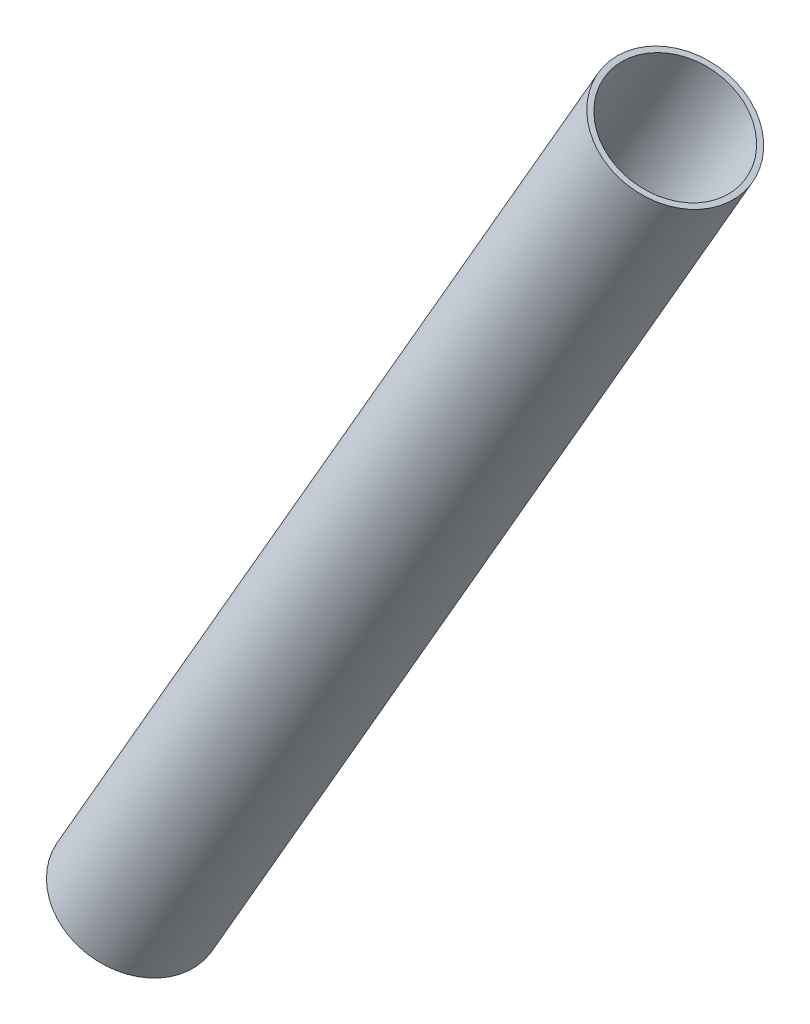
ISO-10303-21;
HEADER;
FILE_DESCRIPTION(('STEP AP214'),'2;1');
FILE_NAME('part.step','',(''),(''),'','','');
FILE_SCHEMA(('AUTOMOTIVE_DESIGN { 1 0 10303 214 1 1 1 1 }'));
ENDSEC;
DATA;
#1=APPLICATION_CONTEXT('core data for automotive mechanical design processes');
#2=APPLICATION_PROTOCOL_DEFINITION('international standard','automotive_design',2000,#1);
#3=PRODUCT_CONTEXT('',#1,'mechanical');
#4=PRODUCT('Part','Part','',(#3));
#5=PRODUCT_RELATED_PRODUCT_CATEGORY('part','',(#4));
#6=PRODUCT_DEFINITION_FORMATION('','',#4);
#7=PRODUCT_DEFINITION_CONTEXT('part definition',#1,'design');
#8=PRODUCT_DEFINITION('design','',#6,#7);
#9=PRODUCT_DEFINITION_SHAPE('','',#8);
#10=(LENGTH_UNIT() NAMED_UNIT(*) SI_UNIT(.MILLI.,.METRE.));
#11=(NAMED_UNIT(*) PLANE_ANGLE_UNIT() SI_UNIT($,.RADIAN.));
#12=(NAMED_UNIT(*) SI_UNIT($,.STERADIAN.) SOLID_ANGLE_UNIT());
#13=UNCERTAINTY_MEASURE_WITH_UNIT(LENGTH_MEASURE(1.E-05),#10,'distance_accuracy_value','');
#14=(GEOMETRIC_REPRESENTATION_CONTEXT(3) GLOBAL_UNCERTAINTY_ASSIGNED_CONTEXT((#13)) GLOBAL_UNIT_ASSIGNED_CONTEXT((#10,
#11,#12)) REPRESENTATION_CONTEXT('',''));
#15=CARTESIAN_POINT('',(0.,0.,0.));
#16=DIRECTION('',(0.,0.,1.));
#17=DIRECTION('',(1.,0.,0.));
#18=AXIS2_PLACEMENT_3D('',#15,#16,#17);
#19=CARTESIAN_POINT('',(113.500000000001,863.919778945286,-386.357743681072));
#20=DIRECTION('',(0.5,0.866025403784439,0.));
#21=DIRECTION('',(-0.866025403784439,0.5,0.));
#22=AXIS2_PLACEMENT_3D('',#19,#20,#21);
#23=CYLINDRICAL_SURFACE('',#22,11.5);
#24=CARTESIAN_POINT('',(38.500000000001,734.01596837762,-386.357743681072));
#25=DIRECTION('',(0.5,0.866025403784439,0.));
#26=DIRECTION('',(-0.866025403784439,0.5,0.));
#27=AXIS2_PLACEMENT_3D('',#24,#25,#26);
#28=CIRCLE('',#27,11.5);
#29=CARTESIAN_POINT('',(28.5407078564799,739.76596837762,-386.357743681072));
#30=VERTEX_POINT('',#29);
#31=EDGE_CURVE('E18',#30,#30,#28,.T.);
#32=ORIENTED_EDGE('',*,*,#31,.F.);
#33=EDGE_LOOP('',(#32));
#34=FACE_BOUND('',#33,.T.);
#35=CARTESIAN_POINT('',(139.500000000001,908.953099942076,-386.357743681072));
#36=DIRECTION('',(0.5,0.866025403784439,0.));
#37=DIRECTION('',(-0.866025403784439,0.5,0.));
#38=AXIS2_PLACEMENT_3D('',#35,#36,#37);
#39=CIRCLE('',#38,11.5);
#40=CARTESIAN_POINT('',(129.54070785648,914.703099942076,-386.357743681072));
#41=VERTEX_POINT('',#40);
#42=EDGE_CURVE('E27',#41,#41,#39,.F.);
#43=ORIENTED_EDGE('',*,*,#42,.F.);
#44=EDGE_LOOP('',(#43));
#45=FACE_BOUND('',#44,.T.);
#46=ADVANCED_FACE('F15',(#34,#45),#23,.F.);
#47=CARTESIAN_POINT('',(38.5000000000014,734.01596837762,-386.357743681072));
#48=DIRECTION('',(-0.5,-0.866025403784439,0.));
#49=DIRECTION('',(0.866025403784439,-0.5,0.));
#50=AXIS2_PLACEMENT_3D('',#47,#48,#49);
#51=PLANE('',#50);
#52=ORIENTED_EDGE('',*,*,#31,.T.);
#53=EDGE_LOOP('',(#52));
#54=FACE_BOUND('',#53,.T.);
#55=CARTESIAN_POINT('',(38.500000000001,734.01596837762,-386.357743681072));
#56=DIRECTION('',(0.5,0.866025403784439,0.));
#57=DIRECTION('',(-0.866025403784439,0.5,0.));
#58=AXIS2_PLACEMENT_3D('',#55,#56,#57);
#59=CIRCLE('',#58,12.5);
#60=CARTESIAN_POINT('',(27.6746824526955,740.26596837762,-386.357743681072));
#61=VERTEX_POINT('',#60);
#62=EDGE_CURVE('E22',#61,#61,#59,.T.);
#63=ORIENTED_EDGE('',*,*,#62,.F.);
#64=EDGE_LOOP('',(#63));
#65=FACE_BOUND('',#64,.T.);
#66=ADVANCED_FACE('F35',(#54,#65),#51,.T.);
#67=CARTESIAN_POINT('',(139.500000000001,908.953099942076,-386.357743681072));
#68=DIRECTION('',(0.5,0.866025403784439,0.));
#69=DIRECTION('',(-0.866025403784439,0.5,0.));
#70=AXIS2_PLACEMENT_3D('',#67,#68,#69);
#71=PLANE('',#70);
#72=ORIENTED_EDGE('',*,*,#42,.T.);
#73=EDGE_LOOP('',(#72));
#74=FACE_BOUND('',#73,.T.);
#75=CARTESIAN_POINT('',(139.500000000001,908.953099942076,-386.357743681072));
#76=DIRECTION('',(0.5,0.866025403784439,0.));
#77=DIRECTION('',(-0.866025403784439,0.5,0.));
#78=AXIS2_PLACEMENT_3D('',#75,#76,#77);
#79=CIRCLE('',#78,12.5);
#80=CARTESIAN_POINT('',(128.674682452695,915.203099942076,-386.357743681072));
#81=VERTEX_POINT('',#80);
#82=EDGE_CURVE('E10',#81,#81,#79,.F.);
#83=ORIENTED_EDGE('',*,*,#82,.F.);
#84=EDGE_LOOP('',(#83));
#85=FACE_BOUND('',#84,.T.);
#86=ADVANCED_FACE('F44',(#74,#85),#71,.T.);
#87=CARTESIAN_POINT('',(113.500000000001,863.919778945286,-386.357743681072));
#88=DIRECTION('',(0.5,0.866025403784439,0.));
#89=DIRECTION('',(-0.866025403784439,0.5,0.));
#90=AXIS2_PLACEMENT_3D('',#87,#88,#89);
#91=CYLINDRICAL_SURFACE('',#90,12.5);
#92=ORIENTED_EDGE('',*,*,#62,.T.);
#93=EDGE_LOOP('',(#92));
#94=FACE_BOUND('',#93,.T.);
#95=ORIENTED_EDGE('',*,*,#82,.T.);
#96=EDGE_LOOP('',(#95));
#97=FACE_BOUND('',#96,.T.);
#98=ADVANCED_FACE('F45',(#94,#97),#91,.T.);
#99=CLOSED_SHELL('',(#46,#66,#86,#98));
#100=MANIFOLD_SOLID_BREP('B1',#99);
#101=ADVANCED_BREP_SHAPE_REPRESENTATION('',(#18,#100),#14);
#102=SHAPE_DEFINITION_REPRESENTATION(#9,#101);
ENDSEC;
END-ISO-10303-21;
